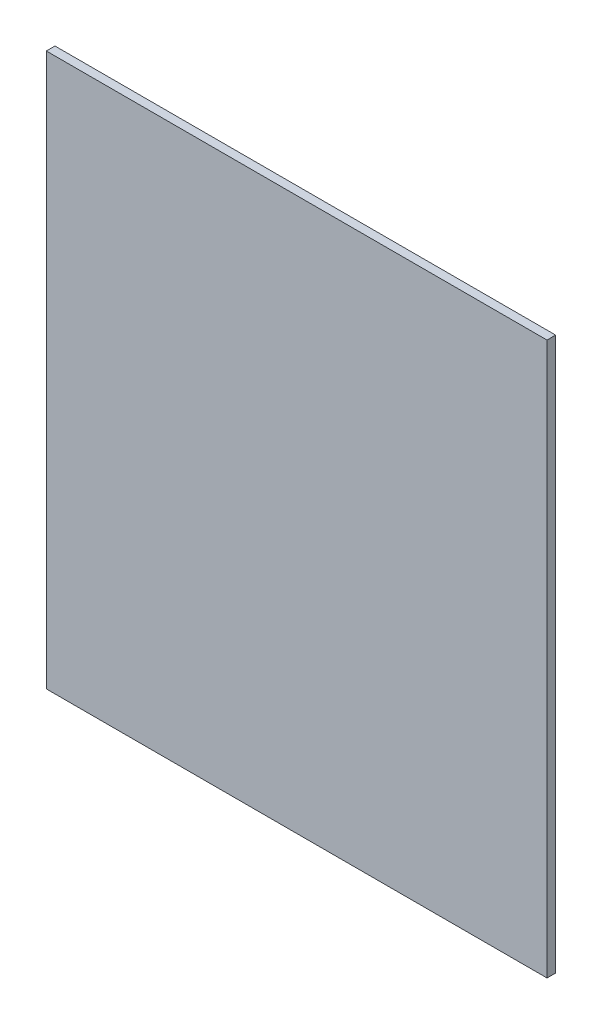
ISO-10303-21;
HEADER;
FILE_DESCRIPTION(('STEP AP214'),'2;1');
FILE_NAME('part.step','',(''),(''),'','','');
FILE_SCHEMA(('AUTOMOTIVE_DESIGN { 1 0 10303 214 1 1 1 1 }'));
ENDSEC;
DATA;
#1=APPLICATION_CONTEXT('core data for automotive mechanical design processes');
#2=APPLICATION_PROTOCOL_DEFINITION('international standard','automotive_design',2000,#1);
#3=PRODUCT_CONTEXT('',#1,'mechanical');
#4=PRODUCT('Part','Part','',(#3));
#5=PRODUCT_RELATED_PRODUCT_CATEGORY('part','',(#4));
#6=PRODUCT_DEFINITION_FORMATION('','',#4);
#7=PRODUCT_DEFINITION_CONTEXT('part definition',#1,'design');
#8=PRODUCT_DEFINITION('design','',#6,#7);
#9=PRODUCT_DEFINITION_SHAPE('','',#8);
#10=(LENGTH_UNIT() NAMED_UNIT(*) SI_UNIT(.MILLI.,.METRE.));
#11=(NAMED_UNIT(*) PLANE_ANGLE_UNIT() SI_UNIT($,.RADIAN.));
#12=(NAMED_UNIT(*) SI_UNIT($,.STERADIAN.) SOLID_ANGLE_UNIT());
#13=UNCERTAINTY_MEASURE_WITH_UNIT(LENGTH_MEASURE(1.E-05),#10,'distance_accuracy_value','');
#14=(GEOMETRIC_REPRESENTATION_CONTEXT(3) GLOBAL_UNCERTAINTY_ASSIGNED_CONTEXT((#13)) GLOBAL_UNIT_ASSIGNED_CONTEXT((#10,
#11,#12)) REPRESENTATION_CONTEXT('',''));
#15=CARTESIAN_POINT('',(0.,0.,0.));
#16=DIRECTION('',(0.,0.,1.));
#17=DIRECTION('',(1.,0.,0.));
#18=AXIS2_PLACEMENT_3D('',#15,#16,#17);
#19=CARTESIAN_POINT('',(0.,0.,5.));
#20=DIRECTION('',(1.,0.,0.));
#21=DIRECTION('',(0.,0.,-1.));
#22=AXIS2_PLACEMENT_3D('',#19,#20,#21);
#23=PLANE('',#22);
#24=DIRECTION('',(0.,-1.,0.));
#25=VECTOR('',#24,1.);
#26=CARTESIAN_POINT('',(0.,0.,0.));
#27=LINE('',#26,#25);
#28=CARTESIAN_POINT('',(0.,320.,0.));
#29=VERTEX_POINT('',#28);
#30=CARTESIAN_POINT('',(0.,0.,0.));
#31=VERTEX_POINT('',#30);
#32=EDGE_CURVE('E98',#29,#31,#27,.T.);
#33=ORIENTED_EDGE('',*,*,#32,.T.);
#34=DIRECTION('',(0.,0.,-1.));
#35=VECTOR('',#34,1.);
#36=CARTESIAN_POINT('',(0.,0.,5.));
#37=LINE('',#36,#35);
#38=CARTESIAN_POINT('',(0.,0.,5.));
#39=VERTEX_POINT('',#38);
#40=EDGE_CURVE('E11',#39,#31,#37,.T.);
#41=ORIENTED_EDGE('',*,*,#40,.F.);
#42=DIRECTION('',(0.,-1.,0.));
#43=VECTOR('',#42,1.);
#44=CARTESIAN_POINT('',(0.,0.,5.));
#45=LINE('',#44,#43);
#46=CARTESIAN_POINT('',(0.,320.,5.));
#47=VERTEX_POINT('',#46);
#48=EDGE_CURVE('E86',#47,#39,#45,.T.);
#49=ORIENTED_EDGE('',*,*,#48,.F.);
#50=DIRECTION('',(0.,0.,-1.));
#51=VECTOR('',#50,1.);
#52=CARTESIAN_POINT('',(0.,320.,5.));
#53=LINE('',#52,#51);
#54=EDGE_CURVE('E94',#47,#29,#53,.T.);
#55=ORIENTED_EDGE('',*,*,#54,.T.);
#56=EDGE_LOOP('',(#33,#41,#49,#55));
#57=FACE_BOUND('',#56,.T.);
#58=ADVANCED_FACE('F35',(#57),#23,.F.);
#59=CARTESIAN_POINT('',(0.,0.,5.));
#60=DIRECTION('',(0.,1.,0.));
#61=DIRECTION('',(0.,0.,1.));
#62=AXIS2_PLACEMENT_3D('',#59,#60,#61);
#63=PLANE('',#62);
#64=DIRECTION('',(1.,0.,0.));
#65=VECTOR('',#64,1.);
#66=CARTESIAN_POINT('',(0.,0.,0.));
#67=LINE('',#66,#65);
#68=CARTESIAN_POINT('',(290.,0.,0.));
#69=VERTEX_POINT('',#68);
#70=EDGE_CURVE('E90',#31,#69,#67,.T.);
#71=ORIENTED_EDGE('',*,*,#70,.T.);
#72=DIRECTION('',(0.,0.,-1.));
#73=VECTOR('',#72,1.);
#74=CARTESIAN_POINT('',(290.,0.,5.));
#75=LINE('',#74,#73);
#76=CARTESIAN_POINT('',(290.,0.,5.));
#77=VERTEX_POINT('',#76);
#78=EDGE_CURVE('E43',#77,#69,#75,.T.);
#79=ORIENTED_EDGE('',*,*,#78,.F.);
#80=DIRECTION('',(1.,0.,0.));
#81=VECTOR('',#80,1.);
#82=CARTESIAN_POINT('',(0.,0.,5.));
#83=LINE('',#82,#81);
#84=EDGE_CURVE('E81',#39,#77,#83,.T.);
#85=ORIENTED_EDGE('',*,*,#84,.F.);
#86=ORIENTED_EDGE('',*,*,#40,.T.);
#87=EDGE_LOOP('',(#71,#79,#85,#86));
#88=FACE_BOUND('',#87,.T.);
#89=ADVANCED_FACE('F89',(#88),#63,.F.);
#90=CARTESIAN_POINT('',(290.,0.,5.));
#91=DIRECTION('',(-1.,0.,0.));
#92=DIRECTION('',(0.,0.,1.));
#93=AXIS2_PLACEMENT_3D('',#90,#91,#92);
#94=PLANE('',#93);
#95=DIRECTION('',(0.,1.,0.));
#96=VECTOR('',#95,1.);
#97=CARTESIAN_POINT('',(290.,0.,0.));
#98=LINE('',#97,#96);
#99=CARTESIAN_POINT('',(290.,320.,0.));
#100=VERTEX_POINT('',#99);
#101=EDGE_CURVE('E68',#69,#100,#98,.T.);
#102=ORIENTED_EDGE('',*,*,#101,.T.);
#103=DIRECTION('',(0.,0.,-1.));
#104=VECTOR('',#103,1.);
#105=CARTESIAN_POINT('',(290.,320.,5.));
#106=LINE('',#105,#104);
#107=CARTESIAN_POINT('',(290.,320.,5.));
#108=VERTEX_POINT('',#107);
#109=EDGE_CURVE('E91',#108,#100,#106,.T.);
#110=ORIENTED_EDGE('',*,*,#109,.F.);
#111=DIRECTION('',(0.,1.,0.));
#112=VECTOR('',#111,1.);
#113=CARTESIAN_POINT('',(290.,0.,5.));
#114=LINE('',#113,#112);
#115=EDGE_CURVE('E84',#77,#108,#114,.T.);
#116=ORIENTED_EDGE('',*,*,#115,.F.);
#117=ORIENTED_EDGE('',*,*,#78,.T.);
#118=EDGE_LOOP('',(#102,#110,#116,#117));
#119=FACE_BOUND('',#118,.T.);
#120=ADVANCED_FACE('F92',(#119),#94,.F.);
#121=CARTESIAN_POINT('',(0.,320.,5.));
#122=DIRECTION('',(0.,-1.,0.));
#123=DIRECTION('',(0.,0.,-1.));
#124=AXIS2_PLACEMENT_3D('',#121,#122,#123);
#125=PLANE('',#124);
#126=DIRECTION('',(-1.,0.,0.));
#127=VECTOR('',#126,1.);
#128=CARTESIAN_POINT('',(0.,320.,0.));
#129=LINE('',#128,#127);
#130=EDGE_CURVE('E74',#100,#29,#129,.T.);
#131=ORIENTED_EDGE('',*,*,#130,.T.);
#132=ORIENTED_EDGE('',*,*,#54,.F.);
#133=DIRECTION('',(-1.,0.,0.));
#134=VECTOR('',#133,1.);
#135=CARTESIAN_POINT('',(0.,320.,5.));
#136=LINE('',#135,#134);
#137=EDGE_CURVE('E51',#108,#47,#136,.T.);
#138=ORIENTED_EDGE('',*,*,#137,.F.);
#139=ORIENTED_EDGE('',*,*,#109,.T.);
#140=EDGE_LOOP('',(#131,#132,#138,#139));
#141=FACE_BOUND('',#140,.T.);
#142=ADVANCED_FACE('F105',(#141),#125,.F.);
#143=CARTESIAN_POINT('',(0.,0.,5.));
#144=DIRECTION('',(0.,0.,-1.));
#145=DIRECTION('',(-1.,0.,0.));
#146=AXIS2_PLACEMENT_3D('',#143,#144,#145);
#147=PLANE('',#146);
#148=ORIENTED_EDGE('',*,*,#48,.T.);
#149=ORIENTED_EDGE('',*,*,#84,.T.);
#150=ORIENTED_EDGE('',*,*,#115,.T.);
#151=ORIENTED_EDGE('',*,*,#137,.T.);
#152=EDGE_LOOP('',(#148,#149,#150,#151));
#153=FACE_BOUND('',#152,.T.);
#154=ADVANCED_FACE('F82',(#153),#147,.F.);
#155=CARTESIAN_POINT('',(0.,0.,0.));
#156=DIRECTION('',(0.,0.,-1.));
#157=DIRECTION('',(-1.,0.,0.));
#158=AXIS2_PLACEMENT_3D('',#155,#156,#157);
#159=PLANE('',#158);
#160=ORIENTED_EDGE('',*,*,#32,.F.);
#161=ORIENTED_EDGE('',*,*,#130,.F.);
#162=ORIENTED_EDGE('',*,*,#101,.F.);
#163=ORIENTED_EDGE('',*,*,#70,.F.);
#164=EDGE_LOOP('',(#160,#161,#162,#163));
#165=FACE_BOUND('',#164,.T.);
#166=ADVANCED_FACE('F108',(#165),#159,.T.);
#167=CLOSED_SHELL('',(#58,#89,#120,#142,#154,#166));
#168=MANIFOLD_SOLID_BREP('B2',#167);
#169=ADVANCED_BREP_SHAPE_REPRESENTATION('',(#18,#168),#14);
#170=SHAPE_DEFINITION_REPRESENTATION(#9,#169);
ENDSEC;
END-ISO-10303-21;
